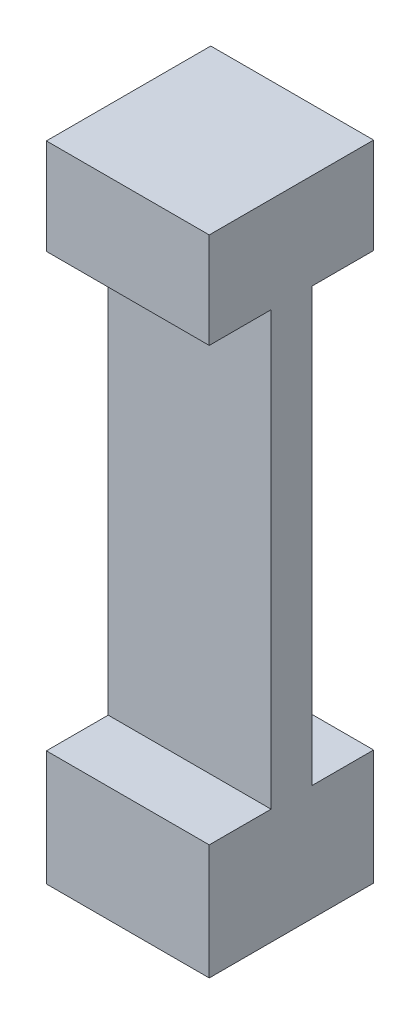
ISO-10303-21;
HEADER;
FILE_DESCRIPTION(('STEP AP214'),'2;1');
FILE_NAME('part.step','',(''),(''),'','','');
FILE_SCHEMA(('AUTOMOTIVE_DESIGN { 1 0 10303 214 1 1 1 1 }'));
ENDSEC;
DATA;
#1=APPLICATION_CONTEXT('core data for automotive mechanical design processes');
#2=APPLICATION_PROTOCOL_DEFINITION('international standard','automotive_design',2000,#1);
#3=PRODUCT_CONTEXT('',#1,'mechanical');
#4=PRODUCT('Part','Part','',(#3));
#5=PRODUCT_RELATED_PRODUCT_CATEGORY('part','',(#4));
#6=PRODUCT_DEFINITION_FORMATION('','',#4);
#7=PRODUCT_DEFINITION_CONTEXT('part definition',#1,'design');
#8=PRODUCT_DEFINITION('design','',#6,#7);
#9=PRODUCT_DEFINITION_SHAPE('','',#8);
#10=(LENGTH_UNIT() NAMED_UNIT(*) SI_UNIT(.MILLI.,.METRE.));
#11=(NAMED_UNIT(*) PLANE_ANGLE_UNIT() SI_UNIT($,.RADIAN.));
#12=(NAMED_UNIT(*) SI_UNIT($,.STERADIAN.) SOLID_ANGLE_UNIT());
#13=UNCERTAINTY_MEASURE_WITH_UNIT(LENGTH_MEASURE(1.E-05),#10,'distance_accuracy_value','');
#14=(GEOMETRIC_REPRESENTATION_CONTEXT(3) GLOBAL_UNCERTAINTY_ASSIGNED_CONTEXT((#13)) GLOBAL_UNIT_ASSIGNED_CONTEXT((#10,
#11,#12)) REPRESENTATION_CONTEXT('',''));
#15=CARTESIAN_POINT('',(0.,0.,0.));
#16=DIRECTION('',(0.,0.,1.));
#17=DIRECTION('',(1.,0.,0.));
#18=AXIS2_PLACEMENT_3D('',#15,#16,#17);
#19=CARTESIAN_POINT('',(-31.5680633759712,0.,10.0267067353836));
#20=DIRECTION('',(0.,0.,-1.));
#21=DIRECTION('',(-1.,0.,0.));
#22=AXIS2_PLACEMENT_3D('',#19,#20,#21);
#23=PLANE('',#22);
#24=DIRECTION('',(-1.,0.,0.));
#25=VECTOR('',#24,1.);
#26=CARTESIAN_POINT('',(-31.5680633759712,252.373598338927,10.0267067353836));
#27=LINE('',#26,#25);
#28=CARTESIAN_POINT('',(48.4000143814819,252.373598338927,10.0267067353836));
#29=VERTEX_POINT('',#28);
#30=CARTESIAN_POINT('',(-31.5680633759712,252.373598338927,10.0267067353836));
#31=VERTEX_POINT('',#30);
#32=EDGE_CURVE('E168',#29,#31,#27,.T.);
#33=ORIENTED_EDGE('',*,*,#32,.T.);
#34=DIRECTION('',(0.,1.,0.));
#35=VECTOR('',#34,1.);
#36=CARTESIAN_POINT('',(-31.5680633759712,0.,10.0267067353836));
#37=LINE('',#36,#35);
#38=CARTESIAN_POINT('',(-31.5680633759712,40.,10.0267067353836));
#39=VERTEX_POINT('',#38);
#40=EDGE_CURVE('E183',#39,#31,#37,.T.);
#41=ORIENTED_EDGE('',*,*,#40,.F.);
#42=DIRECTION('',(1.,0.,0.));
#43=VECTOR('',#42,1.);
#44=CARTESIAN_POINT('',(-31.5680633759712,40.,10.0267067353836));
#45=LINE('',#44,#43);
#46=CARTESIAN_POINT('',(48.4000143814819,40.,10.0267067353836));
#47=VERTEX_POINT('',#46);
#48=EDGE_CURVE('E189',#39,#47,#45,.T.);
#49=ORIENTED_EDGE('',*,*,#48,.T.);
#50=DIRECTION('',(0.,-1.,0.));
#51=VECTOR('',#50,1.);
#52=CARTESIAN_POINT('',(48.4000143814819,409.702848029719,10.0267067353836));
#53=LINE('',#52,#51);
#54=EDGE_CURVE('E49',#29,#47,#53,.T.);
#55=ORIENTED_EDGE('',*,*,#54,.F.);
#56=EDGE_LOOP('',(#33,#41,#49,#55));
#57=FACE_BOUND('',#56,.T.);
#58=ADVANCED_FACE('F41',(#57),#23,.F.);
#59=CARTESIAN_POINT('',(-31.5680633759712,409.702848029719,40.3791279410926));
#60=DIRECTION('',(0.,0.,-1.));
#61=DIRECTION('',(-1.,0.,0.));
#62=AXIS2_PLACEMENT_3D('',#59,#60,#61);
#63=PLANE('',#62);
#64=DIRECTION('',(1.,0.,0.));
#65=VECTOR('',#64,1.);
#66=CARTESIAN_POINT('',(-31.5680633759712,40.,40.3791279410926));
#67=LINE('',#66,#65);
#68=CARTESIAN_POINT('',(-31.5680633759712,40.,40.3791279410926));
#69=VERTEX_POINT('',#68);
#70=CARTESIAN_POINT('',(48.4000143814819,40.,40.3791279410926));
#71=VERTEX_POINT('',#70);
#72=EDGE_CURVE('E136',#69,#71,#67,.T.);
#73=ORIENTED_EDGE('',*,*,#72,.F.);
#74=DIRECTION('',(0.,-1.,0.));
#75=VECTOR('',#74,1.);
#76=CARTESIAN_POINT('',(-31.5680633759712,409.702848029719,40.3791279410926));
#77=LINE('',#76,#75);
#78=CARTESIAN_POINT('',(-31.5680633759712,-16.620094827152,40.3791279410926));
#79=VERTEX_POINT('',#78);
#80=EDGE_CURVE('E131',#69,#79,#77,.T.);
#81=ORIENTED_EDGE('',*,*,#80,.T.);
#82=DIRECTION('',(-1.,0.,0.));
#83=VECTOR('',#82,1.);
#84=CARTESIAN_POINT('',(48.4000143814819,-16.620094827152,40.3791279410926));
#85=LINE('',#84,#83);
#86=CARTESIAN_POINT('',(48.4000143814819,-16.620094827152,40.3791279410926));
#87=VERTEX_POINT('',#86);
#88=EDGE_CURVE('E135',#87,#79,#85,.T.);
#89=ORIENTED_EDGE('',*,*,#88,.F.);
#90=DIRECTION('',(0.,-1.,0.));
#91=VECTOR('',#90,1.);
#92=CARTESIAN_POINT('',(48.4000143814819,409.702848029719,40.3791279410926));
#93=LINE('',#92,#91);
#94=EDGE_CURVE('E192',#71,#87,#93,.T.);
#95=ORIENTED_EDGE('',*,*,#94,.F.);
#96=EDGE_LOOP('',(#73,#81,#89,#95));
#97=FACE_BOUND('',#96,.T.);
#98=ADVANCED_FACE('F133',(#97),#63,.F.);
#99=CARTESIAN_POINT('',(-31.5680633759712,409.702848029719,40.3791279410926));
#100=DIRECTION('',(1.,0.,0.));
#101=DIRECTION('',(0.,0.,-1.));
#102=AXIS2_PLACEMENT_3D('',#99,#100,#101);
#103=PLANE('',#102);
#104=DIRECTION('',(0.,0.,1.));
#105=VECTOR('',#104,1.);
#106=CARTESIAN_POINT('',(-31.5680633759712,40.,0.));
#107=LINE('',#106,#105);
#108=EDGE_CURVE('E186',#39,#69,#107,.T.);
#109=ORIENTED_EDGE('',*,*,#108,.F.);
#110=ORIENTED_EDGE('',*,*,#40,.T.);
#111=DIRECTION('',(0.,0.,1.));
#112=VECTOR('',#111,1.);
#113=CARTESIAN_POINT('',(-31.5680633759712,252.373598338927,40.3791279410926));
#114=LINE('',#113,#112);
#115=CARTESIAN_POINT('',(-31.5680633759712,252.373598338927,40.3791279410926));
#116=VERTEX_POINT('',#115);
#117=EDGE_CURVE('E172',#31,#116,#114,.T.);
#118=ORIENTED_EDGE('',*,*,#117,.T.);
#119=CARTESIAN_POINT('',(-31.5680633759712,299.369898586663,40.3791279410926));
#120=VERTEX_POINT('',#119);
#121=EDGE_CURVE('E140',#120,#116,#77,.T.);
#122=ORIENTED_EDGE('',*,*,#121,.F.);
#123=DIRECTION('',(0.,0.,-1.));
#124=VECTOR('',#123,1.);
#125=CARTESIAN_POINT('',(-31.5680633759712,299.369898586663,40.3791279410926));
#126=LINE('',#125,#124);
#127=CARTESIAN_POINT('',(-31.5680633759712,299.369898586663,-40.3257144703254));
#128=VERTEX_POINT('',#127);
#129=EDGE_CURVE('E209',#120,#128,#126,.T.);
#130=ORIENTED_EDGE('',*,*,#129,.T.);
#131=DIRECTION('',(0.,-1.,0.));
#132=VECTOR('',#131,1.);
#133=CARTESIAN_POINT('',(-31.5680633759712,409.702848029719,-40.3257144703254));
#134=LINE('',#133,#132);
#135=CARTESIAN_POINT('',(-31.5680633759712,252.373598338927,-40.3257144703254));
#136=VERTEX_POINT('',#135);
#137=EDGE_CURVE('E215',#128,#136,#134,.T.);
#138=ORIENTED_EDGE('',*,*,#137,.T.);
#139=DIRECTION('',(0.,0.,1.));
#140=VECTOR('',#139,1.);
#141=CARTESIAN_POINT('',(-31.5680633759712,252.373598338927,0.));
#142=LINE('',#141,#140);
#143=CARTESIAN_POINT('',(-31.5680633759712,252.373598338927,-9.97329326461635));
#144=VERTEX_POINT('',#143);
#145=EDGE_CURVE('E180',#136,#144,#142,.T.);
#146=ORIENTED_EDGE('',*,*,#145,.T.);
#147=DIRECTION('',(0.,-1.,0.));
#148=VECTOR('',#147,1.);
#149=CARTESIAN_POINT('',(-31.5680633759712,0.,-9.97329326461634));
#150=LINE('',#149,#148);
#151=CARTESIAN_POINT('',(-31.5680633759712,40.,-9.97329326461634));
#152=VERTEX_POINT('',#151);
#153=EDGE_CURVE('E196',#144,#152,#150,.T.);
#154=ORIENTED_EDGE('',*,*,#153,.T.);
#155=DIRECTION('',(0.,0.,-1.));
#156=VECTOR('',#155,1.);
#157=CARTESIAN_POINT('',(-31.5680633759712,40.,0.));
#158=LINE('',#157,#156);
#159=CARTESIAN_POINT('',(-31.5680633759712,40.,-40.3257144703254));
#160=VERTEX_POINT('',#159);
#161=EDGE_CURVE('E199',#152,#160,#158,.T.);
#162=ORIENTED_EDGE('',*,*,#161,.T.);
#163=CARTESIAN_POINT('',(-31.5680633759712,-16.620094827152,-40.3257144703254));
#164=VERTEX_POINT('',#163);
#165=EDGE_CURVE('E156',#160,#164,#134,.T.);
#166=ORIENTED_EDGE('',*,*,#165,.T.);
#167=DIRECTION('',(0.,0.,-1.));
#168=VECTOR('',#167,1.);
#169=CARTESIAN_POINT('',(-31.5680633759712,-16.620094827152,40.3791279410926));
#170=LINE('',#169,#168);
#171=EDGE_CURVE('E148',#79,#164,#170,.T.);
#172=ORIENTED_EDGE('',*,*,#171,.F.);
#173=ORIENTED_EDGE('',*,*,#80,.F.);
#174=EDGE_LOOP('',(#109,#110,#118,#122,#130,#138,#146,#154,#162,#166,#172,#173));
#175=FACE_BOUND('',#174,.T.);
#176=ADVANCED_FACE('F153',(#175),#103,.F.);
#177=CARTESIAN_POINT('',(-31.5680633759712,409.702848029719,-40.3257144703254));
#178=DIRECTION('',(0.,0.,1.));
#179=DIRECTION('',(1.,0.,0.));
#180=AXIS2_PLACEMENT_3D('',#177,#178,#179);
#181=PLANE('',#180);
#182=DIRECTION('',(0.,-1.,0.));
#183=VECTOR('',#182,1.);
#184=CARTESIAN_POINT('',(48.4000143814819,409.702848029719,-40.3257144703254));
#185=LINE('',#184,#183);
#186=CARTESIAN_POINT('',(48.4000143814819,299.369898586663,-40.3257144703254));
#187=VERTEX_POINT('',#186);
#188=CARTESIAN_POINT('',(48.4000143814819,252.373598338927,-40.3257144703254));
#189=VERTEX_POINT('',#188);
#190=EDGE_CURVE('E213',#187,#189,#185,.T.);
#191=ORIENTED_EDGE('',*,*,#190,.T.);
#192=DIRECTION('',(1.,0.,0.));
#193=VECTOR('',#192,1.);
#194=CARTESIAN_POINT('',(-31.5680633759712,252.373598338927,-40.3257144703254));
#195=LINE('',#194,#193);
#196=EDGE_CURVE('E187',#136,#189,#195,.T.);
#197=ORIENTED_EDGE('',*,*,#196,.F.);
#198=ORIENTED_EDGE('',*,*,#137,.F.);
#199=DIRECTION('',(1.,0.,0.));
#200=VECTOR('',#199,1.);
#201=CARTESIAN_POINT('',(-31.5680633759712,299.369898586663,-40.3257144703254));
#202=LINE('',#201,#200);
#203=EDGE_CURVE('E166',#128,#187,#202,.T.);
#204=ORIENTED_EDGE('',*,*,#203,.T.);
#205=EDGE_LOOP('',(#191,#197,#198,#204));
#206=FACE_BOUND('',#205,.T.);
#207=ADVANCED_FACE('F231',(#206),#181,.F.);
#208=CARTESIAN_POINT('',(48.4000143814819,409.702848029719,40.3791279410926));
#209=DIRECTION('',(-1.,0.,0.));
#210=DIRECTION('',(0.,0.,1.));
#211=AXIS2_PLACEMENT_3D('',#208,#209,#210);
#212=PLANE('',#211);
#213=DIRECTION('',(0.,0.,-1.));
#214=VECTOR('',#213,1.);
#215=CARTESIAN_POINT('',(48.4000143814819,252.373598338927,10.0267067353836));
#216=LINE('',#215,#214);
#217=CARTESIAN_POINT('',(48.4000143814819,252.373598338927,40.3791279410926));
#218=VERTEX_POINT('',#217);
#219=EDGE_CURVE('E178',#218,#29,#216,.T.);
#220=ORIENTED_EDGE('',*,*,#219,.T.);
#221=ORIENTED_EDGE('',*,*,#54,.T.);
#222=DIRECTION('',(0.,0.,-1.));
#223=VECTOR('',#222,1.);
#224=CARTESIAN_POINT('',(48.4000143814819,40.,40.3791279410926));
#225=LINE('',#224,#223);
#226=EDGE_CURVE('E11',#71,#47,#225,.T.);
#227=ORIENTED_EDGE('',*,*,#226,.F.);
#228=ORIENTED_EDGE('',*,*,#94,.T.);
#229=DIRECTION('',(0.,0.,1.));
#230=VECTOR('',#229,1.);
#231=CARTESIAN_POINT('',(48.4000143814819,-16.620094827152,-40.3257144703254));
#232=LINE('',#231,#230);
#233=CARTESIAN_POINT('',(48.4000143814819,-16.620094827152,-40.3257144703254));
#234=VERTEX_POINT('',#233);
#235=EDGE_CURVE('E151',#234,#87,#232,.T.);
#236=ORIENTED_EDGE('',*,*,#235,.F.);
#237=CARTESIAN_POINT('',(48.4000143814819,40.,-40.3257144703254));
#238=VERTEX_POINT('',#237);
#239=EDGE_CURVE('E218',#238,#234,#185,.T.);
#240=ORIENTED_EDGE('',*,*,#239,.F.);
#241=DIRECTION('',(0.,0.,1.));
#242=VECTOR('',#241,1.);
#243=CARTESIAN_POINT('',(48.4000143814819,40.,40.3791279410926));
#244=LINE('',#243,#242);
#245=CARTESIAN_POINT('',(48.4000143814819,40.,-9.97329326461634));
#246=VERTEX_POINT('',#245);
#247=EDGE_CURVE('E223',#238,#246,#244,.T.);
#248=ORIENTED_EDGE('',*,*,#247,.T.);
#249=DIRECTION('',(0.,1.,0.));
#250=VECTOR('',#249,1.);
#251=CARTESIAN_POINT('',(48.4000143814819,409.702848029719,-9.97329326461634));
#252=LINE('',#251,#250);
#253=CARTESIAN_POINT('',(48.4000143814819,252.373598338927,-9.97329326461634));
#254=VERTEX_POINT('',#253);
#255=EDGE_CURVE('E212',#246,#254,#252,.T.);
#256=ORIENTED_EDGE('',*,*,#255,.T.);
#257=DIRECTION('',(0.,0.,-1.));
#258=VECTOR('',#257,1.);
#259=CARTESIAN_POINT('',(48.4000143814819,252.373598338927,40.3791279410926));
#260=LINE('',#259,#258);
#261=EDGE_CURVE('E226',#254,#189,#260,.T.);
#262=ORIENTED_EDGE('',*,*,#261,.T.);
#263=ORIENTED_EDGE('',*,*,#190,.F.);
#264=DIRECTION('',(0.,0.,1.));
#265=VECTOR('',#264,1.);
#266=CARTESIAN_POINT('',(48.4000143814819,299.369898586663,-120.599257293466));
#267=LINE('',#266,#265);
#268=CARTESIAN_POINT('',(48.4000143814819,299.369898586663,40.3791279410926));
#269=VERTEX_POINT('',#268);
#270=EDGE_CURVE('E161',#187,#269,#267,.T.);
#271=ORIENTED_EDGE('',*,*,#270,.T.);
#272=EDGE_CURVE('E141',#269,#218,#93,.T.);
#273=ORIENTED_EDGE('',*,*,#272,.T.);
#274=EDGE_LOOP('',(#220,#221,#227,#228,#236,#240,#248,#256,#262,#263,#271,#273));
#275=FACE_BOUND('',#274,.T.);
#276=ADVANCED_FACE('F43',(#275),#212,.F.);
#277=ORIENTED_EDGE('',*,*,#121,.T.);
#278=DIRECTION('',(1.,0.,0.));
#279=VECTOR('',#278,1.);
#280=CARTESIAN_POINT('',(48.4000143814819,252.373598338927,40.3791279410926));
#281=LINE('',#280,#279);
#282=EDGE_CURVE('E175',#116,#218,#281,.T.);
#283=ORIENTED_EDGE('',*,*,#282,.T.);
#284=ORIENTED_EDGE('',*,*,#272,.F.);
#285=DIRECTION('',(-1.,0.,0.));
#286=VECTOR('',#285,1.);
#287=CARTESIAN_POINT('',(-31.5680633759712,299.369898586663,40.3791279410926));
#288=LINE('',#287,#286);
#289=EDGE_CURVE('E157',#269,#120,#288,.T.);
#290=ORIENTED_EDGE('',*,*,#289,.T.);
#291=EDGE_LOOP('',(#277,#283,#284,#290));
#292=FACE_BOUND('',#291,.T.);
#293=ADVANCED_FACE('F242',(#292),#63,.F.);
#294=ORIENTED_EDGE('',*,*,#165,.F.);
#295=DIRECTION('',(1.,0.,0.));
#296=VECTOR('',#295,1.);
#297=CARTESIAN_POINT('',(-31.5680633759712,40.,-40.3257144703254));
#298=LINE('',#297,#296);
#299=EDGE_CURVE('E202',#160,#238,#298,.T.);
#300=ORIENTED_EDGE('',*,*,#299,.T.);
#301=ORIENTED_EDGE('',*,*,#239,.T.);
#302=DIRECTION('',(1.,0.,0.));
#303=VECTOR('',#302,1.);
#304=CARTESIAN_POINT('',(-31.5680633759712,-16.620094827152,-40.3257144703254));
#305=LINE('',#304,#303);
#306=EDGE_CURVE('E158',#164,#234,#305,.T.);
#307=ORIENTED_EDGE('',*,*,#306,.F.);
#308=EDGE_LOOP('',(#294,#300,#301,#307));
#309=FACE_BOUND('',#308,.T.);
#310=ADVANCED_FACE('F250',(#309),#181,.F.);
#311=CARTESIAN_POINT('',(-31.5680633759712,252.373598338927,0.));
#312=DIRECTION('',(0.,1.,0.));
#313=DIRECTION('',(0.,0.,1.));
#314=AXIS2_PLACEMENT_3D('',#311,#312,#313);
#315=PLANE('',#314);
#316=DIRECTION('',(1.,0.,0.));
#317=VECTOR('',#316,1.);
#318=CARTESIAN_POINT('',(-31.5680633759712,252.373598338927,-9.97329326461635));
#319=LINE('',#318,#317);
#320=EDGE_CURVE('E56',#144,#254,#319,.T.);
#321=ORIENTED_EDGE('',*,*,#320,.F.);
#322=ORIENTED_EDGE('',*,*,#145,.F.);
#323=ORIENTED_EDGE('',*,*,#196,.T.);
#324=ORIENTED_EDGE('',*,*,#261,.F.);
#325=EDGE_LOOP('',(#321,#322,#323,#324));
#326=FACE_BOUND('',#325,.T.);
#327=ADVANCED_FACE('F262',(#326),#315,.F.);
#328=CARTESIAN_POINT('',(-31.5680633759712,40.,0.));
#329=DIRECTION('',(0.,-1.,0.));
#330=DIRECTION('',(0.,0.,-1.));
#331=AXIS2_PLACEMENT_3D('',#328,#329,#330);
#332=PLANE('',#331);
#333=ORIENTED_EDGE('',*,*,#299,.F.);
#334=ORIENTED_EDGE('',*,*,#161,.F.);
#335=DIRECTION('',(1.,0.,0.));
#336=VECTOR('',#335,1.);
#337=CARTESIAN_POINT('',(-31.5680633759712,40.,-9.97329326461634));
#338=LINE('',#337,#336);
#339=EDGE_CURVE('E205',#152,#246,#338,.T.);
#340=ORIENTED_EDGE('',*,*,#339,.T.);
#341=ORIENTED_EDGE('',*,*,#247,.F.);
#342=EDGE_LOOP('',(#333,#334,#340,#341));
#343=FACE_BOUND('',#342,.T.);
#344=ADVANCED_FACE('F253',(#343),#332,.F.);
#345=CARTESIAN_POINT('',(-31.5680633759712,0.,-9.97329326461634));
#346=DIRECTION('',(0.,0.,1.));
#347=DIRECTION('',(0.,-1.,0.));
#348=AXIS2_PLACEMENT_3D('',#345,#346,#347);
#349=PLANE('',#348);
#350=ORIENTED_EDGE('',*,*,#339,.F.);
#351=ORIENTED_EDGE('',*,*,#153,.F.);
#352=ORIENTED_EDGE('',*,*,#320,.T.);
#353=ORIENTED_EDGE('',*,*,#255,.F.);
#354=EDGE_LOOP('',(#350,#351,#352,#353));
#355=FACE_BOUND('',#354,.T.);
#356=ADVANCED_FACE('F254',(#355),#349,.F.);
#357=CARTESIAN_POINT('',(-31.5680633759712,40.,0.));
#358=DIRECTION('',(0.,1.,0.));
#359=DIRECTION('',(0.,0.,1.));
#360=AXIS2_PLACEMENT_3D('',#357,#358,#359);
#361=PLANE('',#360);
#362=ORIENTED_EDGE('',*,*,#226,.T.);
#363=ORIENTED_EDGE('',*,*,#48,.F.);
#364=ORIENTED_EDGE('',*,*,#108,.T.);
#365=ORIENTED_EDGE('',*,*,#72,.T.);
#366=EDGE_LOOP('',(#362,#363,#364,#365));
#367=FACE_BOUND('',#366,.T.);
#368=ADVANCED_FACE('F247',(#367),#361,.T.);
#369=CARTESIAN_POINT('',(-31.5680633759712,252.373598338927,0.));
#370=DIRECTION('',(0.,1.,0.));
#371=DIRECTION('',(0.,0.,1.));
#372=AXIS2_PLACEMENT_3D('',#369,#370,#371);
#373=PLANE('',#372);
#374=ORIENTED_EDGE('',*,*,#282,.F.);
#375=ORIENTED_EDGE('',*,*,#117,.F.);
#376=ORIENTED_EDGE('',*,*,#32,.F.);
#377=ORIENTED_EDGE('',*,*,#219,.F.);
#378=EDGE_LOOP('',(#374,#375,#376,#377));
#379=FACE_BOUND('',#378,.T.);
#380=ADVANCED_FACE('F241',(#379),#373,.F.);
#381=CARTESIAN_POINT('',(-31.5680633759712,299.369898586663,-120.599257293466));
#382=DIRECTION('',(0.,1.,0.));
#383=DIRECTION('',(-1.,0.,0.));
#384=AXIS2_PLACEMENT_3D('',#381,#382,#383);
#385=PLANE('',#384);
#386=ORIENTED_EDGE('',*,*,#203,.F.);
#387=ORIENTED_EDGE('',*,*,#129,.F.);
#388=ORIENTED_EDGE('',*,*,#289,.F.);
#389=ORIENTED_EDGE('',*,*,#270,.F.);
#390=EDGE_LOOP('',(#386,#387,#388,#389));
#391=FACE_BOUND('',#390,.T.);
#392=ADVANCED_FACE('F236',(#391),#385,.T.);
#393=CARTESIAN_POINT('',(713.301845604674,-16.620094827152,0.0157745734008508));
#394=DIRECTION('',(0.,-1.,0.));
#395=DIRECTION('',(0.,0.,-1.));
#396=AXIS2_PLACEMENT_3D('',#393,#394,#395);
#397=PLANE('',#396);
#398=ORIENTED_EDGE('',*,*,#306,.T.);
#399=ORIENTED_EDGE('',*,*,#235,.T.);
#400=ORIENTED_EDGE('',*,*,#88,.T.);
#401=ORIENTED_EDGE('',*,*,#171,.T.);
#402=EDGE_LOOP('',(#398,#399,#400,#401));
#403=FACE_BOUND('',#402,.T.);
#404=ADVANCED_FACE('F147',(#403),#397,.T.);
#405=CLOSED_SHELL('',(#58,#98,#176,#207,#276,#293,#310,#327,#344,#356,#368,#380,#392,#404));
#406=MANIFOLD_SOLID_BREP('B2',#405);
#407=ADVANCED_BREP_SHAPE_REPRESENTATION('',(#18,#406),#14);
#408=SHAPE_DEFINITION_REPRESENTATION(#9,#407);
ENDSEC;
END-ISO-10303-21;
